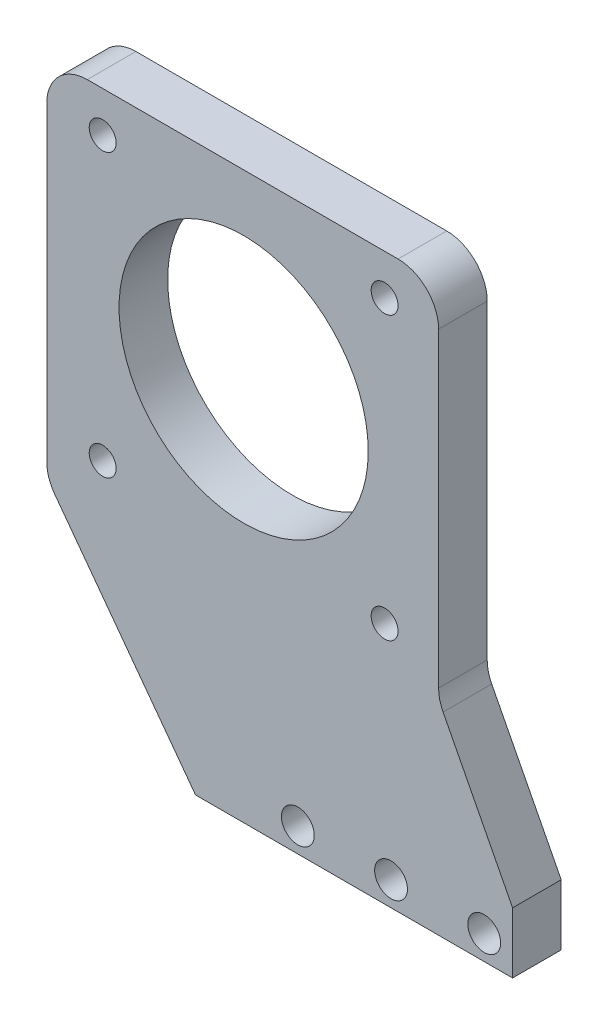
ISO-10303-21;
HEADER;
FILE_DESCRIPTION(('STEP AP214'),'2;1');
FILE_NAME('part.step','',(''),(''),'','','');
FILE_SCHEMA(('AUTOMOTIVE_DESIGN { 1 0 10303 214 1 1 1 1 }'));
ENDSEC;
DATA;
#1=APPLICATION_CONTEXT('core data for automotive mechanical design processes');
#2=APPLICATION_PROTOCOL_DEFINITION('international standard','automotive_design',2000,#1);
#3=PRODUCT_CONTEXT('',#1,'mechanical');
#4=PRODUCT('Part','Part','',(#3));
#5=PRODUCT_RELATED_PRODUCT_CATEGORY('part','',(#4));
#6=PRODUCT_DEFINITION_FORMATION('','',#4);
#7=PRODUCT_DEFINITION_CONTEXT('part definition',#1,'design');
#8=PRODUCT_DEFINITION('design','',#6,#7);
#9=PRODUCT_DEFINITION_SHAPE('','',#8);
#10=(LENGTH_UNIT() NAMED_UNIT(*) SI_UNIT(.MILLI.,.METRE.));
#11=(NAMED_UNIT(*) PLANE_ANGLE_UNIT() SI_UNIT($,.RADIAN.));
#12=(NAMED_UNIT(*) SI_UNIT($,.STERADIAN.) SOLID_ANGLE_UNIT());
#13=UNCERTAINTY_MEASURE_WITH_UNIT(LENGTH_MEASURE(1.E-05),#10,'distance_accuracy_value','');
#14=(GEOMETRIC_REPRESENTATION_CONTEXT(3) GLOBAL_UNCERTAINTY_ASSIGNED_CONTEXT((#13)) GLOBAL_UNIT_ASSIGNED_CONTEXT((#10,
#11,#12)) REPRESENTATION_CONTEXT('',''));
#15=CARTESIAN_POINT('',(0.,0.,0.));
#16=DIRECTION('',(0.,0.,1.));
#17=DIRECTION('',(1.,0.,0.));
#18=AXIS2_PLACEMENT_3D('',#15,#16,#17);
#19=CARTESIAN_POINT('',(25.24898238,6.00000000000001,-6.));
#20=DIRECTION('',(0.,0.,1.));
#21=DIRECTION('',(1.,0.,0.));
#22=AXIS2_PLACEMENT_3D('',#19,#20,#21);
#23=CYLINDRICAL_SURFACE('',#22,4.05);
#24=CARTESIAN_POINT('',(25.24898238,6.00000000000001,-6.));
#25=DIRECTION('',(0.,0.,1.));
#26=DIRECTION('',(1.,0.,0.));
#27=AXIS2_PLACEMENT_3D('',#24,#25,#26);
#28=CIRCLE('',#27,4.05);
#29=CARTESIAN_POINT('',(29.29898238,6.00000000000001,-6.));
#30=VERTEX_POINT('',#29);
#31=EDGE_CURVE('E50',#30,#30,#28,.T.);
#32=ORIENTED_EDGE('',*,*,#31,.F.);
#33=EDGE_LOOP('',(#32));
#34=FACE_BOUND('',#33,.T.);
#35=CARTESIAN_POINT('',(25.24898238,6.00000000000001,6.));
#36=DIRECTION('',(0.,0.,1.));
#37=DIRECTION('',(1.,0.,0.));
#38=AXIS2_PLACEMENT_3D('',#35,#36,#37);
#39=CIRCLE('',#38,4.05);
#40=CARTESIAN_POINT('',(29.29898238,6.00000000000001,6.));
#41=VERTEX_POINT('',#40);
#42=EDGE_CURVE('E12',#41,#41,#39,.T.);
#43=ORIENTED_EDGE('',*,*,#42,.T.);
#44=EDGE_LOOP('',(#43));
#45=FACE_BOUND('',#44,.T.);
#46=ADVANCED_FACE('F41',(#34,#45),#23,.F.);
#47=CARTESIAN_POINT('',(69.9847200315453,52.8473783721098,6.));
#48=DIRECTION('',(0.,0.,-1.));
#49=DIRECTION('',(-1.,0.,0.));
#50=AXIS2_PLACEMENT_3D('',#47,#48,#49);
#51=PLANE('',#50);
#52=CARTESIAN_POINT('',(48.24898238,6.00000000000001,6.));
#53=DIRECTION('',(0.,0.,1.));
#54=DIRECTION('',(1.,0.,0.));
#55=AXIS2_PLACEMENT_3D('',#52,#53,#54);
#56=CIRCLE('',#55,4.05);
#57=CARTESIAN_POINT('',(52.29898238,6.00000000000001,6.));
#58=VERTEX_POINT('',#57);
#59=EDGE_CURVE('E406',#58,#58,#56,.T.);
#60=ORIENTED_EDGE('',*,*,#59,.F.);
#61=EDGE_LOOP('',(#60));
#62=FACE_BOUND('',#61,.T.);
#63=CARTESIAN_POINT('',(71.24898238,6.00000000000001,6.));
#64=DIRECTION('',(0.,0.,1.));
#65=DIRECTION('',(1.,0.,0.));
#66=AXIS2_PLACEMENT_3D('',#63,#64,#65);
#67=CIRCLE('',#66,4.05);
#68=CARTESIAN_POINT('',(75.29898238,6.00000000000001,6.));
#69=VERTEX_POINT('',#68);
#70=EDGE_CURVE('E351',#69,#69,#67,.T.);
#71=ORIENTED_EDGE('',*,*,#70,.F.);
#72=EDGE_LOOP('',(#71));
#73=FACE_BOUND('',#72,.T.);
#74=DIRECTION('',(1.,0.,0.));
#75=VECTOR('',#74,1.);
#76=CARTESIAN_POINT('',(0.,0.,6.));
#77=LINE('',#76,#75);
#78=CARTESIAN_POINT('',(0.,0.,6.));
#79=VERTEX_POINT('',#78);
#80=CARTESIAN_POINT('',(78.24898238,0.,6.));
#81=VERTEX_POINT('',#80);
#82=EDGE_CURVE('E181',#79,#81,#77,.T.);
#83=ORIENTED_EDGE('',*,*,#82,.T.);
#84=DIRECTION('',(0.,1.,0.));
#85=VECTOR('',#84,1.);
#86=CARTESIAN_POINT('',(78.24898238,0.,6.));
#87=LINE('',#86,#85);
#88=CARTESIAN_POINT('',(78.24898238,15.,6.));
#89=VERTEX_POINT('',#88);
#90=EDGE_CURVE('E111',#81,#89,#87,.T.);
#91=ORIENTED_EDGE('',*,*,#90,.T.);
#92=DIRECTION('',(-0.458295315382966,0.88879997969061,0.));
#93=VECTOR('',#92,1.);
#94=CARTESIAN_POINT('',(78.24898238,15.,6.));
#95=LINE('',#94,#93);
#96=CARTESIAN_POINT('',(61.0967202346392,48.2644252182801,6.));
#97=VERTEX_POINT('',#96);
#98=EDGE_CURVE('E195',#89,#97,#95,.T.);
#99=ORIENTED_EDGE('',*,*,#98,.T.);
#100=CARTESIAN_POINT('',(69.9847200315453,52.8473783721098,6.));
#101=DIRECTION('',(0.,0.,-1.));
#102=DIRECTION('',(-1.,0.,0.));
#103=AXIS2_PLACEMENT_3D('',#100,#101,#102);
#104=CIRCLE('',#103,10.);
#105=CARTESIAN_POINT('',(59.9847200315453,52.8473783721098,6.));
#106=VERTEX_POINT('',#105);
#107=EDGE_CURVE('E197',#97,#106,#104,.T.);
#108=ORIENTED_EDGE('',*,*,#107,.T.);
#109=DIRECTION('',(0.,1.,0.));
#110=VECTOR('',#109,1.);
#111=CARTESIAN_POINT('',(59.9847200315453,52.8473783721098,6.));
#112=LINE('',#111,#110);
#113=CARTESIAN_POINT('',(59.9847200315453,129.546127467458,6.));
#114=VERTEX_POINT('',#113);
#115=EDGE_CURVE('E200',#106,#114,#112,.T.);
#116=ORIENTED_EDGE('',*,*,#115,.T.);
#117=CARTESIAN_POINT('',(49.9847200315453,129.546127467458,6.));
#118=DIRECTION('',(0.,0.,1.));
#119=DIRECTION('',(1.,0.,0.));
#120=AXIS2_PLACEMENT_3D('',#117,#118,#119);
#121=CIRCLE('',#120,10.);
#122=CARTESIAN_POINT('',(49.9847200315453,139.546127467458,6.));
#123=VERTEX_POINT('',#122);
#124=EDGE_CURVE('E203',#114,#123,#121,.T.);
#125=ORIENTED_EDGE('',*,*,#124,.T.);
#126=DIRECTION('',(-1.,0.,0.));
#127=VECTOR('',#126,1.);
#128=CARTESIAN_POINT('',(49.9847200315453,139.546127467458,6.));
#129=LINE('',#128,#127);
#130=CARTESIAN_POINT('',(-26.7140290638032,139.546127467458,6.));
#131=VERTEX_POINT('',#130);
#132=EDGE_CURVE('E208',#123,#131,#129,.T.);
#133=ORIENTED_EDGE('',*,*,#132,.T.);
#134=CARTESIAN_POINT('',(-26.7140290638032,129.546127467458,6.));
#135=DIRECTION('',(0.,0.,1.));
#136=DIRECTION('',(1.,0.,0.));
#137=AXIS2_PLACEMENT_3D('',#134,#135,#136);
#138=CIRCLE('',#137,10.);
#139=CARTESIAN_POINT('',(-36.7140290638032,129.546127467458,6.));
#140=VERTEX_POINT('',#139);
#141=EDGE_CURVE('E140',#131,#140,#138,.T.);
#142=ORIENTED_EDGE('',*,*,#141,.T.);
#143=DIRECTION('',(0.,-1.,0.));
#144=VECTOR('',#143,1.);
#145=CARTESIAN_POINT('',(-36.7140290638032,52.8473783721098,6.));
#146=LINE('',#145,#144);
#147=CARTESIAN_POINT('',(-36.7140290638032,52.8473783721098,6.));
#148=VERTEX_POINT('',#147);
#149=EDGE_CURVE('E133',#140,#148,#146,.T.);
#150=ORIENTED_EDGE('',*,*,#149,.T.);
#151=CARTESIAN_POINT('',(-26.7140290638032,52.8473783721098,6.));
#152=DIRECTION('',(0.,0.,1.));
#153=DIRECTION('',(-1.,0.,0.));
#154=AXIS2_PLACEMENT_3D('',#151,#152,#153);
#155=CIRCLE('',#154,10.);
#156=CARTESIAN_POINT('',(-34.7485775269335,46.8937214292207,6.));
#157=VERTEX_POINT('',#156);
#158=EDGE_CURVE('E138',#148,#157,#155,.T.);
#159=ORIENTED_EDGE('',*,*,#158,.T.);
#160=DIRECTION('',(0.595365694288907,-0.803454846313025,0.));
#161=VECTOR('',#160,1.);
#162=CARTESIAN_POINT('',(-34.7485775269335,46.8937214292207,6.));
#163=LINE('',#162,#161);
#164=EDGE_CURVE('E58',#157,#79,#163,.T.);
#165=ORIENTED_EDGE('',*,*,#164,.T.);
#166=EDGE_LOOP('',(#83,#91,#99,#108,#116,#125,#133,#142,#150,#159,#165));
#167=FACE_BOUND('',#166,.T.);
#168=CARTESIAN_POINT('',(11.87148929,94.76591255,6.));
#169=DIRECTION('',(0.,0.,1.));
#170=DIRECTION('',(1.,0.,0.));
#171=AXIS2_PLACEMENT_3D('',#168,#169,#170);
#172=CIRCLE('',#171,30.75);
#173=CARTESIAN_POINT('',(42.62148929,94.76591255,6.));
#174=VERTEX_POINT('',#173);
#175=EDGE_CURVE('E170',#174,#174,#172,.T.);
#176=ORIENTED_EDGE('',*,*,#175,.F.);
#177=EDGE_LOOP('',(#176));
#178=FACE_BOUND('',#177,.T.);
#179=CARTESIAN_POINT('',(-22.91851071,129.55591255,6.));
#180=DIRECTION('',(0.,0.,1.));
#181=DIRECTION('',(1.,0.,0.));
#182=AXIS2_PLACEMENT_3D('',#179,#180,#181);
#183=CIRCLE('',#182,3.32500000000001);
#184=CARTESIAN_POINT('',(-19.59351071,129.55591255,6.));
#185=VERTEX_POINT('',#184);
#186=EDGE_CURVE('E180',#185,#185,#183,.T.);
#187=ORIENTED_EDGE('',*,*,#186,.F.);
#188=EDGE_LOOP('',(#187));
#189=FACE_BOUND('',#188,.T.);
#190=CARTESIAN_POINT('',(46.66148929,129.55591255,6.));
#191=DIRECTION('',(0.,0.,1.));
#192=DIRECTION('',(1.,0.,0.));
#193=AXIS2_PLACEMENT_3D('',#190,#191,#192);
#194=CIRCLE('',#193,3.32500000000001);
#195=CARTESIAN_POINT('',(49.98648929,129.55591255,6.));
#196=VERTEX_POINT('',#195);
#197=EDGE_CURVE('E361',#196,#196,#194,.T.);
#198=ORIENTED_EDGE('',*,*,#197,.F.);
#199=EDGE_LOOP('',(#198));
#200=FACE_BOUND('',#199,.T.);
#201=CARTESIAN_POINT('',(46.66148929,59.97591255,6.));
#202=DIRECTION('',(0.,0.,1.));
#203=DIRECTION('',(1.,0.,0.));
#204=AXIS2_PLACEMENT_3D('',#201,#202,#203);
#205=CIRCLE('',#204,3.325);
#206=CARTESIAN_POINT('',(49.98648929,59.97591255,6.));
#207=VERTEX_POINT('',#206);
#208=EDGE_CURVE('E355',#207,#207,#205,.T.);
#209=ORIENTED_EDGE('',*,*,#208,.F.);
#210=EDGE_LOOP('',(#209));
#211=FACE_BOUND('',#210,.T.);
#212=CARTESIAN_POINT('',(-22.91851071,59.97591255,6.));
#213=DIRECTION('',(0.,0.,1.));
#214=DIRECTION('',(1.,0.,0.));
#215=AXIS2_PLACEMENT_3D('',#212,#213,#214);
#216=CIRCLE('',#215,3.325);
#217=CARTESIAN_POINT('',(-19.59351071,59.97591255,6.));
#218=VERTEX_POINT('',#217);
#219=EDGE_CURVE('E344',#218,#218,#216,.T.);
#220=ORIENTED_EDGE('',*,*,#219,.F.);
#221=EDGE_LOOP('',(#220));
#222=FACE_BOUND('',#221,.T.);
#223=ORIENTED_EDGE('',*,*,#42,.F.);
#224=EDGE_LOOP('',(#223));
#225=FACE_BOUND('',#224,.T.);
#226=ADVANCED_FACE('F135',(#62,#73,#167,#178,#189,#200,#211,#222,#225),#51,.F.);
#227=CARTESIAN_POINT('',(69.9847200315453,52.8473783721098,-6.));
#228=DIRECTION('',(0.,0.,-1.));
#229=DIRECTION('',(-1.,0.,0.));
#230=AXIS2_PLACEMENT_3D('',#227,#228,#229);
#231=PLANE('',#230);
#232=CARTESIAN_POINT('',(48.24898238,6.00000000000001,-6.));
#233=DIRECTION('',(0.,0.,1.));
#234=DIRECTION('',(1.,0.,0.));
#235=AXIS2_PLACEMENT_3D('',#232,#233,#234);
#236=CIRCLE('',#235,4.05);
#237=CARTESIAN_POINT('',(52.29898238,6.00000000000001,-6.));
#238=VERTEX_POINT('',#237);
#239=EDGE_CURVE('E404',#238,#238,#236,.T.);
#240=ORIENTED_EDGE('',*,*,#239,.T.);
#241=EDGE_LOOP('',(#240));
#242=FACE_BOUND('',#241,.T.);
#243=CARTESIAN_POINT('',(71.24898238,6.00000000000001,-6.));
#244=DIRECTION('',(0.,0.,1.));
#245=DIRECTION('',(1.,0.,0.));
#246=AXIS2_PLACEMENT_3D('',#243,#244,#245);
#247=CIRCLE('',#246,4.05);
#248=CARTESIAN_POINT('',(75.29898238,6.00000000000001,-6.));
#249=VERTEX_POINT('',#248);
#250=EDGE_CURVE('E345',#249,#249,#247,.T.);
#251=ORIENTED_EDGE('',*,*,#250,.T.);
#252=EDGE_LOOP('',(#251));
#253=FACE_BOUND('',#252,.T.);
#254=CARTESIAN_POINT('',(46.66148929,59.97591255,-6.));
#255=DIRECTION('',(0.,0.,1.));
#256=DIRECTION('',(1.,0.,0.));
#257=AXIS2_PLACEMENT_3D('',#254,#255,#256);
#258=CIRCLE('',#257,3.325);
#259=CARTESIAN_POINT('',(49.98648929,59.97591255,-6.));
#260=VERTEX_POINT('',#259);
#261=EDGE_CURVE('E348',#260,#260,#258,.T.);
#262=ORIENTED_EDGE('',*,*,#261,.T.);
#263=EDGE_LOOP('',(#262));
#264=FACE_BOUND('',#263,.T.);
#265=CARTESIAN_POINT('',(-22.91851071,129.55591255,-6.));
#266=DIRECTION('',(0.,0.,1.));
#267=DIRECTION('',(1.,0.,0.));
#268=AXIS2_PLACEMENT_3D('',#265,#266,#267);
#269=CIRCLE('',#268,3.32500000000001);
#270=CARTESIAN_POINT('',(-19.59351071,129.55591255,-6.));
#271=VERTEX_POINT('',#270);
#272=EDGE_CURVE('E177',#271,#271,#269,.T.);
#273=ORIENTED_EDGE('',*,*,#272,.T.);
#274=EDGE_LOOP('',(#273));
#275=FACE_BOUND('',#274,.T.);
#276=DIRECTION('',(1.,0.,0.));
#277=VECTOR('',#276,1.);
#278=CARTESIAN_POINT('',(0.,0.,-6.));
#279=LINE('',#278,#277);
#280=CARTESIAN_POINT('',(0.,0.,-6.));
#281=VERTEX_POINT('',#280);
#282=CARTESIAN_POINT('',(78.24898238,0.,-6.));
#283=VERTEX_POINT('',#282);
#284=EDGE_CURVE('E175',#281,#283,#279,.T.);
#285=ORIENTED_EDGE('',*,*,#284,.F.);
#286=DIRECTION('',(0.595365694288907,-0.803454846313025,0.));
#287=VECTOR('',#286,1.);
#288=CARTESIAN_POINT('',(-34.7485775269335,46.8937214292207,-6.));
#289=LINE('',#288,#287);
#290=CARTESIAN_POINT('',(-34.7485775269335,46.8937214292207,-6.));
#291=VERTEX_POINT('',#290);
#292=EDGE_CURVE('E102',#291,#281,#289,.T.);
#293=ORIENTED_EDGE('',*,*,#292,.F.);
#294=CARTESIAN_POINT('',(-26.7140290638032,52.8473783721098,-6.));
#295=DIRECTION('',(0.,0.,1.));
#296=DIRECTION('',(-1.,0.,0.));
#297=AXIS2_PLACEMENT_3D('',#294,#295,#296);
#298=CIRCLE('',#297,10.);
#299=CARTESIAN_POINT('',(-36.7140290638032,52.8473783721098,-6.));
#300=VERTEX_POINT('',#299);
#301=EDGE_CURVE('E96',#300,#291,#298,.T.);
#302=ORIENTED_EDGE('',*,*,#301,.F.);
#303=DIRECTION('',(0.,-1.,0.));
#304=VECTOR('',#303,1.);
#305=CARTESIAN_POINT('',(-36.7140290638032,52.8473783721098,-6.));
#306=LINE('',#305,#304);
#307=CARTESIAN_POINT('',(-36.7140290638032,129.546127467458,-6.));
#308=VERTEX_POINT('',#307);
#309=EDGE_CURVE('E148',#308,#300,#306,.T.);
#310=ORIENTED_EDGE('',*,*,#309,.F.);
#311=CARTESIAN_POINT('',(-26.7140290638032,129.546127467458,-6.));
#312=DIRECTION('',(0.,0.,1.));
#313=DIRECTION('',(1.,0.,0.));
#314=AXIS2_PLACEMENT_3D('',#311,#312,#313);
#315=CIRCLE('',#314,10.);
#316=CARTESIAN_POINT('',(-26.7140290638032,139.546127467458,-6.));
#317=VERTEX_POINT('',#316);
#318=EDGE_CURVE('E236',#317,#308,#315,.T.);
#319=ORIENTED_EDGE('',*,*,#318,.F.);
#320=DIRECTION('',(-1.,0.,0.));
#321=VECTOR('',#320,1.);
#322=CARTESIAN_POINT('',(49.9847200315453,139.546127467458,-6.));
#323=LINE('',#322,#321);
#324=CARTESIAN_POINT('',(49.9847200315453,139.546127467458,-6.));
#325=VERTEX_POINT('',#324);
#326=EDGE_CURVE('E231',#325,#317,#323,.T.);
#327=ORIENTED_EDGE('',*,*,#326,.F.);
#328=CARTESIAN_POINT('',(49.9847200315453,129.546127467458,-6.));
#329=DIRECTION('',(0.,0.,1.));
#330=DIRECTION('',(1.,0.,0.));
#331=AXIS2_PLACEMENT_3D('',#328,#329,#330);
#332=CIRCLE('',#331,10.);
#333=CARTESIAN_POINT('',(59.9847200315453,129.546127467458,-6.));
#334=VERTEX_POINT('',#333);
#335=EDGE_CURVE('E223',#334,#325,#332,.T.);
#336=ORIENTED_EDGE('',*,*,#335,.F.);
#337=DIRECTION('',(0.,1.,0.));
#338=VECTOR('',#337,1.);
#339=CARTESIAN_POINT('',(59.9847200315453,52.8473783721098,-6.));
#340=LINE('',#339,#338);
#341=CARTESIAN_POINT('',(59.9847200315453,52.8473783721098,-6.));
#342=VERTEX_POINT('',#341);
#343=EDGE_CURVE('E318',#342,#334,#340,.T.);
#344=ORIENTED_EDGE('',*,*,#343,.F.);
#345=CARTESIAN_POINT('',(69.9847200315453,52.8473783721098,-6.));
#346=DIRECTION('',(0.,0.,-1.));
#347=DIRECTION('',(-1.,0.,0.));
#348=AXIS2_PLACEMENT_3D('',#345,#346,#347);
#349=CIRCLE('',#348,10.);
#350=CARTESIAN_POINT('',(61.0967202346392,48.2644252182801,-6.));
#351=VERTEX_POINT('',#350);
#352=EDGE_CURVE('E316',#351,#342,#349,.T.);
#353=ORIENTED_EDGE('',*,*,#352,.F.);
#354=DIRECTION('',(-0.458295315382966,0.88879997969061,0.));
#355=VECTOR('',#354,1.);
#356=CARTESIAN_POINT('',(78.24898238,15.,-6.));
#357=LINE('',#356,#355);
#358=CARTESIAN_POINT('',(78.24898238,15.,-6.));
#359=VERTEX_POINT('',#358);
#360=EDGE_CURVE('E312',#359,#351,#357,.T.);
#361=ORIENTED_EDGE('',*,*,#360,.F.);
#362=DIRECTION('',(0.,1.,0.));
#363=VECTOR('',#362,1.);
#364=CARTESIAN_POINT('',(78.24898238,0.,-6.));
#365=LINE('',#364,#363);
#366=EDGE_CURVE('E311',#283,#359,#365,.T.);
#367=ORIENTED_EDGE('',*,*,#366,.F.);
#368=EDGE_LOOP('',(#285,#293,#302,#310,#319,#327,#336,#344,#353,#361,#367));
#369=FACE_BOUND('',#368,.T.);
#370=CARTESIAN_POINT('',(11.87148929,94.76591255,-6.));
#371=DIRECTION('',(0.,0.,1.));
#372=DIRECTION('',(1.,0.,0.));
#373=AXIS2_PLACEMENT_3D('',#370,#371,#372);
#374=CIRCLE('',#373,30.75);
#375=CARTESIAN_POINT('',(42.62148929,94.76591255,-6.));
#376=VERTEX_POINT('',#375);
#377=EDGE_CURVE('E176',#376,#376,#374,.T.);
#378=ORIENTED_EDGE('',*,*,#377,.T.);
#379=EDGE_LOOP('',(#378));
#380=FACE_BOUND('',#379,.T.);
#381=CARTESIAN_POINT('',(46.66148929,129.55591255,-6.));
#382=DIRECTION('',(0.,0.,1.));
#383=DIRECTION('',(1.,0.,0.));
#384=AXIS2_PLACEMENT_3D('',#381,#382,#383);
#385=CIRCLE('',#384,3.32500000000001);
#386=CARTESIAN_POINT('',(49.98648929,129.55591255,-6.));
#387=VERTEX_POINT('',#386);
#388=EDGE_CURVE('E339',#387,#387,#385,.T.);
#389=ORIENTED_EDGE('',*,*,#388,.T.);
#390=EDGE_LOOP('',(#389));
#391=FACE_BOUND('',#390,.T.);
#392=CARTESIAN_POINT('',(-22.91851071,59.97591255,-6.));
#393=DIRECTION('',(0.,0.,1.));
#394=DIRECTION('',(1.,0.,0.));
#395=AXIS2_PLACEMENT_3D('',#392,#393,#394);
#396=CIRCLE('',#395,3.325);
#397=CARTESIAN_POINT('',(-19.59351071,59.97591255,-6.));
#398=VERTEX_POINT('',#397);
#399=EDGE_CURVE('E342',#398,#398,#396,.T.);
#400=ORIENTED_EDGE('',*,*,#399,.T.);
#401=EDGE_LOOP('',(#400));
#402=FACE_BOUND('',#401,.T.);
#403=ORIENTED_EDGE('',*,*,#31,.T.);
#404=EDGE_LOOP('',(#403));
#405=FACE_BOUND('',#404,.T.);
#406=ADVANCED_FACE('F254',(#242,#253,#264,#275,#369,#380,#391,#402,#405),#231,.T.);
#407=CARTESIAN_POINT('',(0.,0.,6.));
#408=DIRECTION('',(0.,1.,0.));
#409=DIRECTION('',(0.,0.,1.));
#410=AXIS2_PLACEMENT_3D('',#407,#408,#409);
#411=PLANE('',#410);
#412=ORIENTED_EDGE('',*,*,#284,.T.);
#413=DIRECTION('',(0.,0.,-1.));
#414=VECTOR('',#413,1.);
#415=CARTESIAN_POINT('',(78.24898238,0.,6.));
#416=LINE('',#415,#414);
#417=EDGE_CURVE('E250',#81,#283,#416,.T.);
#418=ORIENTED_EDGE('',*,*,#417,.F.);
#419=ORIENTED_EDGE('',*,*,#82,.F.);
#420=DIRECTION('',(0.,0.,-1.));
#421=VECTOR('',#420,1.);
#422=CARTESIAN_POINT('',(0.,0.,6.));
#423=LINE('',#422,#421);
#424=EDGE_CURVE('E154',#79,#281,#423,.T.);
#425=ORIENTED_EDGE('',*,*,#424,.T.);
#426=EDGE_LOOP('',(#412,#418,#419,#425));
#427=FACE_BOUND('',#426,.T.);
#428=ADVANCED_FACE('F266',(#427),#411,.F.);
#429=CARTESIAN_POINT('',(78.24898238,0.,6.));
#430=DIRECTION('',(-1.,0.,0.));
#431=DIRECTION('',(0.,0.,1.));
#432=AXIS2_PLACEMENT_3D('',#429,#430,#431);
#433=PLANE('',#432);
#434=ORIENTED_EDGE('',*,*,#366,.T.);
#435=DIRECTION('',(0.,0.,-1.));
#436=VECTOR('',#435,1.);
#437=CARTESIAN_POINT('',(78.24898238,15.,6.));
#438=LINE('',#437,#436);
#439=EDGE_CURVE('E247',#89,#359,#438,.T.);
#440=ORIENTED_EDGE('',*,*,#439,.F.);
#441=ORIENTED_EDGE('',*,*,#90,.F.);
#442=ORIENTED_EDGE('',*,*,#417,.T.);
#443=EDGE_LOOP('',(#434,#440,#441,#442));
#444=FACE_BOUND('',#443,.T.);
#445=ADVANCED_FACE('F299',(#444),#433,.F.);
#446=CARTESIAN_POINT('',(78.24898238,15.,6.));
#447=DIRECTION('',(-0.888799979690609,-0.458295315382966,0.));
#448=DIRECTION('',(0.458295315382966,-0.88879997969061,0.));
#449=AXIS2_PLACEMENT_3D('',#446,#447,#448);
#450=PLANE('',#449);
#451=ORIENTED_EDGE('',*,*,#360,.T.);
#452=DIRECTION('',(0.,0.,-1.));
#453=VECTOR('',#452,1.);
#454=CARTESIAN_POINT('',(61.0967202346392,48.2644252182801,6.));
#455=LINE('',#454,#453);
#456=EDGE_CURVE('E244',#97,#351,#455,.T.);
#457=ORIENTED_EDGE('',*,*,#456,.F.);
#458=ORIENTED_EDGE('',*,*,#98,.F.);
#459=ORIENTED_EDGE('',*,*,#439,.T.);
#460=EDGE_LOOP('',(#451,#457,#458,#459));
#461=FACE_BOUND('',#460,.T.);
#462=ADVANCED_FACE('F295',(#461),#450,.F.);
#463=CARTESIAN_POINT('',(69.9847200315453,52.8473783721098,6.));
#464=DIRECTION('',(0.,0.,-1.));
#465=DIRECTION('',(-1.,0.,0.));
#466=AXIS2_PLACEMENT_3D('',#463,#464,#465);
#467=CYLINDRICAL_SURFACE('',#466,10.);
#468=ORIENTED_EDGE('',*,*,#352,.T.);
#469=DIRECTION('',(0.,0.,-1.));
#470=VECTOR('',#469,1.);
#471=CARTESIAN_POINT('',(59.9847200315453,52.8473783721098,6.));
#472=LINE('',#471,#470);
#473=EDGE_CURVE('E241',#106,#342,#472,.T.);
#474=ORIENTED_EDGE('',*,*,#473,.F.);
#475=ORIENTED_EDGE('',*,*,#107,.F.);
#476=ORIENTED_EDGE('',*,*,#456,.T.);
#477=EDGE_LOOP('',(#468,#474,#475,#476));
#478=FACE_BOUND('',#477,.T.);
#479=ADVANCED_FACE('F291',(#478),#467,.F.);
#480=CARTESIAN_POINT('',(59.9847200315453,52.8473783721098,6.));
#481=DIRECTION('',(-1.,0.,0.));
#482=DIRECTION('',(0.,0.,1.));
#483=AXIS2_PLACEMENT_3D('',#480,#481,#482);
#484=PLANE('',#483);
#485=ORIENTED_EDGE('',*,*,#343,.T.);
#486=DIRECTION('',(0.,0.,-1.));
#487=VECTOR('',#486,1.);
#488=CARTESIAN_POINT('',(59.9847200315453,129.546127467458,6.));
#489=LINE('',#488,#487);
#490=EDGE_CURVE('E226',#114,#334,#489,.T.);
#491=ORIENTED_EDGE('',*,*,#490,.F.);
#492=ORIENTED_EDGE('',*,*,#115,.F.);
#493=ORIENTED_EDGE('',*,*,#473,.T.);
#494=EDGE_LOOP('',(#485,#491,#492,#493));
#495=FACE_BOUND('',#494,.T.);
#496=ADVANCED_FACE('F288',(#495),#484,.F.);
#497=CARTESIAN_POINT('',(49.9847200315453,129.546127467458,6.));
#498=DIRECTION('',(0.,0.,-1.));
#499=DIRECTION('',(-1.,0.,0.));
#500=AXIS2_PLACEMENT_3D('',#497,#498,#499);
#501=CYLINDRICAL_SURFACE('',#500,10.);
#502=ORIENTED_EDGE('',*,*,#335,.T.);
#503=DIRECTION('',(0.,0.,-1.));
#504=VECTOR('',#503,1.);
#505=CARTESIAN_POINT('',(49.9847200315453,139.546127467458,6.));
#506=LINE('',#505,#504);
#507=EDGE_CURVE('E220',#123,#325,#506,.T.);
#508=ORIENTED_EDGE('',*,*,#507,.F.);
#509=ORIENTED_EDGE('',*,*,#124,.F.);
#510=ORIENTED_EDGE('',*,*,#490,.T.);
#511=EDGE_LOOP('',(#502,#508,#509,#510));
#512=FACE_BOUND('',#511,.T.);
#513=ADVANCED_FACE('F221',(#512),#501,.T.);
#514=CARTESIAN_POINT('',(49.9847200315453,139.546127467458,6.));
#515=DIRECTION('',(0.,-1.,0.));
#516=DIRECTION('',(0.,0.,-1.));
#517=AXIS2_PLACEMENT_3D('',#514,#515,#516);
#518=PLANE('',#517);
#519=ORIENTED_EDGE('',*,*,#326,.T.);
#520=DIRECTION('',(0.,0.,-1.));
#521=VECTOR('',#520,1.);
#522=CARTESIAN_POINT('',(-26.7140290638032,139.546127467458,6.));
#523=LINE('',#522,#521);
#524=EDGE_CURVE('E227',#131,#317,#523,.T.);
#525=ORIENTED_EDGE('',*,*,#524,.F.);
#526=ORIENTED_EDGE('',*,*,#132,.F.);
#527=ORIENTED_EDGE('',*,*,#507,.T.);
#528=EDGE_LOOP('',(#519,#525,#526,#527));
#529=FACE_BOUND('',#528,.T.);
#530=ADVANCED_FACE('F229',(#529),#518,.F.);
#531=CARTESIAN_POINT('',(-26.7140290638032,129.546127467458,6.));
#532=DIRECTION('',(0.,0.,-1.));
#533=DIRECTION('',(-1.,0.,0.));
#534=AXIS2_PLACEMENT_3D('',#531,#532,#533);
#535=CYLINDRICAL_SURFACE('',#534,10.);
#536=ORIENTED_EDGE('',*,*,#318,.T.);
#537=DIRECTION('',(0.,0.,-1.));
#538=VECTOR('',#537,1.);
#539=CARTESIAN_POINT('',(-36.7140290638032,129.546127467458,6.));
#540=LINE('',#539,#538);
#541=EDGE_CURVE('E149',#140,#308,#540,.T.);
#542=ORIENTED_EDGE('',*,*,#541,.F.);
#543=ORIENTED_EDGE('',*,*,#141,.F.);
#544=ORIENTED_EDGE('',*,*,#524,.T.);
#545=EDGE_LOOP('',(#536,#542,#543,#544));
#546=FACE_BOUND('',#545,.T.);
#547=ADVANCED_FACE('F235',(#546),#535,.T.);
#548=CARTESIAN_POINT('',(-36.7140290638032,52.8473783721098,6.));
#549=DIRECTION('',(1.,0.,0.));
#550=DIRECTION('',(0.,0.,-1.));
#551=AXIS2_PLACEMENT_3D('',#548,#549,#550);
#552=PLANE('',#551);
#553=ORIENTED_EDGE('',*,*,#309,.T.);
#554=DIRECTION('',(0.,0.,-1.));
#555=VECTOR('',#554,1.);
#556=CARTESIAN_POINT('',(-36.7140290638032,52.8473783721098,6.));
#557=LINE('',#556,#555);
#558=EDGE_CURVE('E145',#148,#300,#557,.T.);
#559=ORIENTED_EDGE('',*,*,#558,.F.);
#560=ORIENTED_EDGE('',*,*,#149,.F.);
#561=ORIENTED_EDGE('',*,*,#541,.T.);
#562=EDGE_LOOP('',(#553,#559,#560,#561));
#563=FACE_BOUND('',#562,.T.);
#564=ADVANCED_FACE('F146',(#563),#552,.F.);
#565=CARTESIAN_POINT('',(-26.7140290638032,52.8473783721098,6.));
#566=DIRECTION('',(0.,0.,-1.));
#567=DIRECTION('',(-1.,0.,0.));
#568=AXIS2_PLACEMENT_3D('',#565,#566,#567);
#569=CYLINDRICAL_SURFACE('',#568,10.);
#570=ORIENTED_EDGE('',*,*,#301,.T.);
#571=DIRECTION('',(0.,0.,-1.));
#572=VECTOR('',#571,1.);
#573=CARTESIAN_POINT('',(-34.7485775269335,46.8937214292207,6.));
#574=LINE('',#573,#572);
#575=EDGE_CURVE('E150',#157,#291,#574,.T.);
#576=ORIENTED_EDGE('',*,*,#575,.F.);
#577=ORIENTED_EDGE('',*,*,#158,.F.);
#578=ORIENTED_EDGE('',*,*,#558,.T.);
#579=EDGE_LOOP('',(#570,#576,#577,#578));
#580=FACE_BOUND('',#579,.T.);
#581=ADVANCED_FACE('F152',(#580),#569,.T.);
#582=CARTESIAN_POINT('',(-34.7485775269335,46.8937214292207,6.));
#583=DIRECTION('',(0.803454846313025,0.595365694288907,0.));
#584=DIRECTION('',(-0.595365694288907,0.803454846313026,0.));
#585=AXIS2_PLACEMENT_3D('',#582,#583,#584);
#586=PLANE('',#585);
#587=ORIENTED_EDGE('',*,*,#292,.T.);
#588=ORIENTED_EDGE('',*,*,#424,.F.);
#589=ORIENTED_EDGE('',*,*,#164,.F.);
#590=ORIENTED_EDGE('',*,*,#575,.T.);
#591=EDGE_LOOP('',(#587,#588,#589,#590));
#592=FACE_BOUND('',#591,.T.);
#593=ADVANCED_FACE('F275',(#592),#586,.F.);
#594=CARTESIAN_POINT('',(11.87148929,94.76591255,6.));
#595=DIRECTION('',(0.,0.,-1.));
#596=DIRECTION('',(-1.,0.,0.));
#597=AXIS2_PLACEMENT_3D('',#594,#595,#596);
#598=CYLINDRICAL_SURFACE('',#597,30.75);
#599=ORIENTED_EDGE('',*,*,#175,.T.);
#600=EDGE_LOOP('',(#599));
#601=FACE_BOUND('',#600,.T.);
#602=ORIENTED_EDGE('',*,*,#377,.F.);
#603=EDGE_LOOP('',(#602));
#604=FACE_BOUND('',#603,.T.);
#605=ADVANCED_FACE('F272',(#601,#604),#598,.F.);
#606=CARTESIAN_POINT('',(-22.91851071,129.55591255,6.));
#607=DIRECTION('',(0.,0.,-1.));
#608=DIRECTION('',(-1.,0.,0.));
#609=AXIS2_PLACEMENT_3D('',#606,#607,#608);
#610=CYLINDRICAL_SURFACE('',#609,3.32500000000001);
#611=ORIENTED_EDGE('',*,*,#186,.T.);
#612=EDGE_LOOP('',(#611));
#613=FACE_BOUND('',#612,.T.);
#614=ORIENTED_EDGE('',*,*,#272,.F.);
#615=EDGE_LOOP('',(#614));
#616=FACE_BOUND('',#615,.T.);
#617=ADVANCED_FACE('F373',(#613,#616),#610,.F.);
#618=CARTESIAN_POINT('',(46.66148929,129.55591255,6.));
#619=DIRECTION('',(0.,0.,-1.));
#620=DIRECTION('',(-1.,0.,0.));
#621=AXIS2_PLACEMENT_3D('',#618,#619,#620);
#622=CYLINDRICAL_SURFACE('',#621,3.32500000000001);
#623=ORIENTED_EDGE('',*,*,#197,.T.);
#624=EDGE_LOOP('',(#623));
#625=FACE_BOUND('',#624,.T.);
#626=ORIENTED_EDGE('',*,*,#388,.F.);
#627=EDGE_LOOP('',(#626));
#628=FACE_BOUND('',#627,.T.);
#629=ADVANCED_FACE('F375',(#625,#628),#622,.F.);
#630=CARTESIAN_POINT('',(46.66148929,59.97591255,6.));
#631=DIRECTION('',(0.,0.,-1.));
#632=DIRECTION('',(-1.,0.,0.));
#633=AXIS2_PLACEMENT_3D('',#630,#631,#632);
#634=CYLINDRICAL_SURFACE('',#633,3.325);
#635=ORIENTED_EDGE('',*,*,#208,.T.);
#636=EDGE_LOOP('',(#635));
#637=FACE_BOUND('',#636,.T.);
#638=ORIENTED_EDGE('',*,*,#261,.F.);
#639=EDGE_LOOP('',(#638));
#640=FACE_BOUND('',#639,.T.);
#641=ADVANCED_FACE('F380',(#637,#640),#634,.F.);
#642=CARTESIAN_POINT('',(-22.91851071,59.97591255,6.));
#643=DIRECTION('',(0.,0.,-1.));
#644=DIRECTION('',(-1.,0.,0.));
#645=AXIS2_PLACEMENT_3D('',#642,#643,#644);
#646=CYLINDRICAL_SURFACE('',#645,3.325);
#647=ORIENTED_EDGE('',*,*,#219,.T.);
#648=EDGE_LOOP('',(#647));
#649=FACE_BOUND('',#648,.T.);
#650=ORIENTED_EDGE('',*,*,#399,.F.);
#651=EDGE_LOOP('',(#650));
#652=FACE_BOUND('',#651,.T.);
#653=ADVANCED_FACE('F387',(#649,#652),#646,.F.);
#654=CARTESIAN_POINT('',(71.24898238,6.00000000000001,-6.));
#655=DIRECTION('',(0.,0.,1.));
#656=DIRECTION('',(1.,0.,0.));
#657=AXIS2_PLACEMENT_3D('',#654,#655,#656);
#658=CYLINDRICAL_SURFACE('',#657,4.05);
#659=ORIENTED_EDGE('',*,*,#250,.F.);
#660=EDGE_LOOP('',(#659));
#661=FACE_BOUND('',#660,.T.);
#662=ORIENTED_EDGE('',*,*,#70,.T.);
#663=EDGE_LOOP('',(#662));
#664=FACE_BOUND('',#663,.T.);
#665=ADVANCED_FACE('F391',(#661,#664),#658,.F.);
#666=CARTESIAN_POINT('',(48.24898238,6.00000000000001,-6.));
#667=DIRECTION('',(0.,0.,1.));
#668=DIRECTION('',(1.,0.,0.));
#669=AXIS2_PLACEMENT_3D('',#666,#667,#668);
#670=CYLINDRICAL_SURFACE('',#669,4.05);
#671=ORIENTED_EDGE('',*,*,#239,.F.);
#672=EDGE_LOOP('',(#671));
#673=FACE_BOUND('',#672,.T.);
#674=ORIENTED_EDGE('',*,*,#59,.T.);
#675=EDGE_LOOP('',(#674));
#676=FACE_BOUND('',#675,.T.);
#677=ADVANCED_FACE('F395',(#673,#676),#670,.F.);
#678=CLOSED_SHELL('',(#46,#226,#406,#428,#445,#462,#479,#496,#513,#530,#547,#564,#581,#593,#605,
#617,#629,#641,#653,#665,#677));
#679=MANIFOLD_SOLID_BREP('B2',#678);
#680=ADVANCED_BREP_SHAPE_REPRESENTATION('',(#18,#679),#14);
#681=SHAPE_DEFINITION_REPRESENTATION(#9,#680);
ENDSEC;
END-ISO-10303-21;
